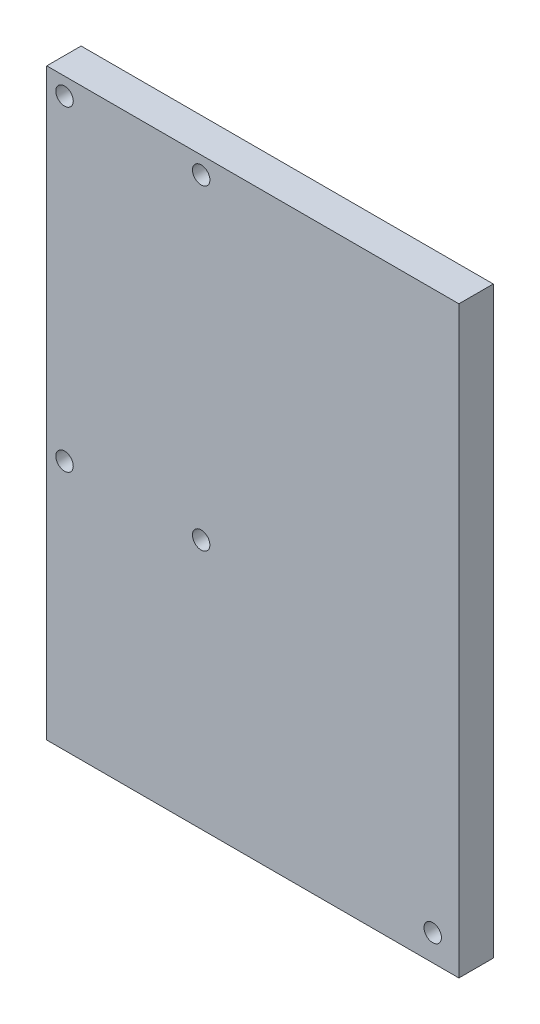
ISO-10303-21;
HEADER;
FILE_DESCRIPTION(('STEP AP214'),'2;1');
FILE_NAME('part.step','',(''),(''),'','','');
FILE_SCHEMA(('AUTOMOTIVE_DESIGN { 1 0 10303 214 1 1 1 1 }'));
ENDSEC;
DATA;
#1=APPLICATION_CONTEXT('core data for automotive mechanical design processes');
#2=APPLICATION_PROTOCOL_DEFINITION('international standard','automotive_design',2000,#1);
#3=PRODUCT_CONTEXT('',#1,'mechanical');
#4=PRODUCT('Part','Part','',(#3));
#5=PRODUCT_RELATED_PRODUCT_CATEGORY('part','',(#4));
#6=PRODUCT_DEFINITION_FORMATION('','',#4);
#7=PRODUCT_DEFINITION_CONTEXT('part definition',#1,'design');
#8=PRODUCT_DEFINITION('design','',#6,#7);
#9=PRODUCT_DEFINITION_SHAPE('','',#8);
#10=(LENGTH_UNIT() NAMED_UNIT(*) SI_UNIT(.MILLI.,.METRE.));
#11=(NAMED_UNIT(*) PLANE_ANGLE_UNIT() SI_UNIT($,.RADIAN.));
#12=(NAMED_UNIT(*) SI_UNIT($,.STERADIAN.) SOLID_ANGLE_UNIT());
#13=UNCERTAINTY_MEASURE_WITH_UNIT(LENGTH_MEASURE(1.E-05),#10,'distance_accuracy_value','');
#14=(GEOMETRIC_REPRESENTATION_CONTEXT(3) GLOBAL_UNCERTAINTY_ASSIGNED_CONTEXT((#13)) GLOBAL_UNIT_ASSIGNED_CONTEXT((#10,
#11,#12)) REPRESENTATION_CONTEXT('',''));
#15=CARTESIAN_POINT('',(0.,0.,0.));
#16=DIRECTION('',(0.,0.,1.));
#17=DIRECTION('',(1.,0.,0.));
#18=AXIS2_PLACEMENT_3D('',#15,#16,#17);
#19=CARTESIAN_POINT('',(-12.5348999999999,25.527,5.));
#20=DIRECTION('',(0.,1.,0.));
#21=DIRECTION('',(-1.,0.,0.));
#22=AXIS2_PLACEMENT_3D('',#19,#20,#21);
#23=PLANE('',#22);
#24=DIRECTION('',(1.,0.,0.));
#25=VECTOR('',#24,1.);
#26=CARTESIAN_POINT('',(-12.5348999999999,25.527,0.));
#27=LINE('',#26,#25);
#28=CARTESIAN_POINT('',(-12.5348999999999,25.527,0.));
#29=VERTEX_POINT('',#28);
#30=CARTESIAN_POINT('',(47.4651000000001,25.527,0.));
#31=VERTEX_POINT('',#30);
#32=EDGE_CURVE('E110',#29,#31,#27,.T.);
#33=ORIENTED_EDGE('',*,*,#32,.F.);
#34=DIRECTION('',(0.,0.,-1.));
#35=VECTOR('',#34,1.);
#36=CARTESIAN_POINT('',(-12.5348999999999,25.527,5.));
#37=LINE('',#36,#35);
#38=CARTESIAN_POINT('',(-12.5348999999999,25.527,5.));
#39=VERTEX_POINT('',#38);
#40=EDGE_CURVE('E11',#39,#29,#37,.T.);
#41=ORIENTED_EDGE('',*,*,#40,.F.);
#42=DIRECTION('',(1.,0.,0.));
#43=VECTOR('',#42,1.);
#44=CARTESIAN_POINT('',(-12.5348999999999,25.527,5.));
#45=LINE('',#44,#43);
#46=CARTESIAN_POINT('',(47.4651000000001,25.527,5.));
#47=VERTEX_POINT('',#46);
#48=EDGE_CURVE('E101',#39,#47,#45,.T.);
#49=ORIENTED_EDGE('',*,*,#48,.T.);
#50=DIRECTION('',(0.,0.,-1.));
#51=VECTOR('',#50,1.);
#52=CARTESIAN_POINT('',(47.4651000000001,25.527,5.));
#53=LINE('',#52,#51);
#54=EDGE_CURVE('E78',#47,#31,#53,.T.);
#55=ORIENTED_EDGE('',*,*,#54,.T.);
#56=EDGE_LOOP('',(#33,#41,#49,#55));
#57=FACE_BOUND('',#56,.T.);
#58=ADVANCED_FACE('F39',(#57),#23,.T.);
#59=CARTESIAN_POINT('',(-12.5348999999999,25.527,5.));
#60=DIRECTION('',(1.,0.,0.));
#61=DIRECTION('',(0.,1.,0.));
#62=AXIS2_PLACEMENT_3D('',#59,#60,#61);
#63=PLANE('',#62);
#64=DIRECTION('',(0.,-1.,0.));
#65=VECTOR('',#64,1.);
#66=CARTESIAN_POINT('',(-12.5348999999999,25.527,0.));
#67=LINE('',#66,#65);
#68=CARTESIAN_POINT('',(-12.5348999999999,-59.473,0.));
#69=VERTEX_POINT('',#68);
#70=EDGE_CURVE('E75',#29,#69,#67,.T.);
#71=ORIENTED_EDGE('',*,*,#70,.T.);
#72=DIRECTION('',(0.,0.,-1.));
#73=VECTOR('',#72,1.);
#74=CARTESIAN_POINT('',(-12.5348999999999,-59.473,5.));
#75=LINE('',#74,#73);
#76=CARTESIAN_POINT('',(-12.5348999999999,-59.473,5.));
#77=VERTEX_POINT('',#76);
#78=EDGE_CURVE('E48',#77,#69,#75,.T.);
#79=ORIENTED_EDGE('',*,*,#78,.F.);
#80=DIRECTION('',(0.,-1.,0.));
#81=VECTOR('',#80,1.);
#82=CARTESIAN_POINT('',(-12.5348999999999,25.527,5.));
#83=LINE('',#82,#81);
#84=EDGE_CURVE('E89',#39,#77,#83,.T.);
#85=ORIENTED_EDGE('',*,*,#84,.F.);
#86=ORIENTED_EDGE('',*,*,#40,.T.);
#87=EDGE_LOOP('',(#71,#79,#85,#86));
#88=FACE_BOUND('',#87,.T.);
#89=ADVANCED_FACE('F146',(#88),#63,.F.);
#90=CARTESIAN_POINT('',(-12.5348999999999,-59.473,5.));
#91=DIRECTION('',(0.,1.,0.));
#92=DIRECTION('',(0.,0.,1.));
#93=AXIS2_PLACEMENT_3D('',#90,#91,#92);
#94=PLANE('',#93);
#95=DIRECTION('',(1.,0.,0.));
#96=VECTOR('',#95,1.);
#97=CARTESIAN_POINT('',(-12.5348999999999,-59.473,0.));
#98=LINE('',#97,#96);
#99=CARTESIAN_POINT('',(47.4651000000001,-59.473,0.));
#100=VERTEX_POINT('',#99);
#101=EDGE_CURVE('E100',#69,#100,#98,.T.);
#102=ORIENTED_EDGE('',*,*,#101,.T.);
#103=DIRECTION('',(0.,0.,-1.));
#104=VECTOR('',#103,1.);
#105=CARTESIAN_POINT('',(47.4651000000001,-59.473,5.));
#106=LINE('',#105,#104);
#107=CARTESIAN_POINT('',(47.4651000000001,-59.473,5.));
#108=VERTEX_POINT('',#107);
#109=EDGE_CURVE('E94',#108,#100,#106,.T.);
#110=ORIENTED_EDGE('',*,*,#109,.F.);
#111=DIRECTION('',(1.,0.,0.));
#112=VECTOR('',#111,1.);
#113=CARTESIAN_POINT('',(-12.5348999999999,-59.473,5.));
#114=LINE('',#113,#112);
#115=EDGE_CURVE('E83',#77,#108,#114,.T.);
#116=ORIENTED_EDGE('',*,*,#115,.F.);
#117=ORIENTED_EDGE('',*,*,#78,.T.);
#118=EDGE_LOOP('',(#102,#110,#116,#117));
#119=FACE_BOUND('',#118,.T.);
#120=ADVANCED_FACE('F92',(#119),#94,.F.);
#121=CARTESIAN_POINT('',(47.4651000000001,25.527,5.));
#122=DIRECTION('',(1.,0.,0.));
#123=DIRECTION('',(0.,1.,0.));
#124=AXIS2_PLACEMENT_3D('',#121,#122,#123);
#125=PLANE('',#124);
#126=DIRECTION('',(0.,-1.,0.));
#127=VECTOR('',#126,1.);
#128=CARTESIAN_POINT('',(47.4651000000001,25.527,0.));
#129=LINE('',#128,#127);
#130=EDGE_CURVE('E109',#31,#100,#129,.T.);
#131=ORIENTED_EDGE('',*,*,#130,.F.);
#132=ORIENTED_EDGE('',*,*,#54,.F.);
#133=DIRECTION('',(0.,-1.,0.));
#134=VECTOR('',#133,1.);
#135=CARTESIAN_POINT('',(47.4651000000001,25.527,5.));
#136=LINE('',#135,#134);
#137=EDGE_CURVE('E90',#47,#108,#136,.T.);
#138=ORIENTED_EDGE('',*,*,#137,.T.);
#139=ORIENTED_EDGE('',*,*,#109,.T.);
#140=EDGE_LOOP('',(#131,#132,#138,#139));
#141=FACE_BOUND('',#140,.T.);
#142=ADVANCED_FACE('F99',(#141),#125,.T.);
#143=CARTESIAN_POINT('',(0.,0.,5.));
#144=DIRECTION('',(0.,0.,-1.));
#145=DIRECTION('',(-1.,0.,0.));
#146=AXIS2_PLACEMENT_3D('',#143,#144,#145);
#147=PLANE('',#146);
#148=CARTESIAN_POINT('',(43.6551,-55.6630000000007,5.));
#149=DIRECTION('',(0.,0.,1.));
#150=DIRECTION('',(1.,0.,0.));
#151=AXIS2_PLACEMENT_3D('',#148,#149,#150);
#152=CIRCLE('',#151,1.27);
#153=CARTESIAN_POINT('',(44.9251,-55.6630000000007,5.));
#154=VERTEX_POINT('',#153);
#155=EDGE_CURVE('E200',#154,#154,#152,.T.);
#156=ORIENTED_EDGE('',*,*,#155,.F.);
#157=EDGE_LOOP('',(#156));
#158=FACE_BOUND('',#157,.T.);
#159=CARTESIAN_POINT('',(9.94410000000011,23.0124,5.));
#160=DIRECTION('',(0.,0.,1.));
#161=DIRECTION('',(1.,0.,0.));
#162=AXIS2_PLACEMENT_3D('',#159,#160,#161);
#163=CIRCLE('',#162,1.27);
#164=CARTESIAN_POINT('',(11.2141000000001,23.0124,5.));
#165=VERTEX_POINT('',#164);
#166=EDGE_CURVE('E191',#165,#165,#163,.T.);
#167=ORIENTED_EDGE('',*,*,#166,.F.);
#168=EDGE_LOOP('',(#167));
#169=FACE_BOUND('',#168,.T.);
#170=CARTESIAN_POINT('',(-9.9440999999999,23.0124,5.));
#171=DIRECTION('',(0.,0.,1.));
#172=DIRECTION('',(1.,0.,0.));
#173=AXIS2_PLACEMENT_3D('',#170,#171,#172);
#174=CIRCLE('',#173,1.27);
#175=CARTESIAN_POINT('',(-8.67409999999989,23.0124,5.));
#176=VERTEX_POINT('',#175);
#177=EDGE_CURVE('E188',#176,#176,#174,.T.);
#178=ORIENTED_EDGE('',*,*,#177,.F.);
#179=EDGE_LOOP('',(#178));
#180=FACE_BOUND('',#179,.T.);
#181=CARTESIAN_POINT('',(-9.9440999999999,-23.0124,5.));
#182=DIRECTION('',(0.,0.,1.));
#183=DIRECTION('',(1.,0.,0.));
#184=AXIS2_PLACEMENT_3D('',#181,#182,#183);
#185=CIRCLE('',#184,1.27);
#186=CARTESIAN_POINT('',(-8.67409999999989,-23.0124,5.));
#187=VERTEX_POINT('',#186);
#188=EDGE_CURVE('E190',#187,#187,#185,.T.);
#189=ORIENTED_EDGE('',*,*,#188,.F.);
#190=EDGE_LOOP('',(#189));
#191=FACE_BOUND('',#190,.T.);
#192=CARTESIAN_POINT('',(9.94410000000011,-23.0124,5.));
#193=DIRECTION('',(0.,0.,1.));
#194=DIRECTION('',(1.,0.,0.));
#195=AXIS2_PLACEMENT_3D('',#192,#193,#194);
#196=CIRCLE('',#195,1.27);
#197=CARTESIAN_POINT('',(11.2141000000001,-23.0124,5.));
#198=VERTEX_POINT('',#197);
#199=EDGE_CURVE('E118',#198,#198,#196,.T.);
#200=ORIENTED_EDGE('',*,*,#199,.F.);
#201=EDGE_LOOP('',(#200));
#202=FACE_BOUND('',#201,.T.);
#203=ORIENTED_EDGE('',*,*,#48,.F.);
#204=ORIENTED_EDGE('',*,*,#84,.T.);
#205=ORIENTED_EDGE('',*,*,#115,.T.);
#206=ORIENTED_EDGE('',*,*,#137,.F.);
#207=EDGE_LOOP('',(#203,#204,#205,#206));
#208=FACE_BOUND('',#207,.T.);
#209=ADVANCED_FACE('F86',(#158,#169,#180,#191,#202,#208),#147,.F.);
#210=CARTESIAN_POINT('',(0.,0.,0.));
#211=DIRECTION('',(0.,0.,-1.));
#212=DIRECTION('',(-1.,0.,0.));
#213=AXIS2_PLACEMENT_3D('',#210,#211,#212);
#214=PLANE('',#213);
#215=CARTESIAN_POINT('',(43.6551,-55.6630000000007,0.));
#216=DIRECTION('',(0.,0.,-1.));
#217=DIRECTION('',(-1.,0.,0.));
#218=AXIS2_PLACEMENT_3D('',#215,#216,#217);
#219=CIRCLE('',#218,1.27);
#220=CARTESIAN_POINT('',(42.3851,-55.6630000000007,0.));
#221=VERTEX_POINT('',#220);
#222=EDGE_CURVE('E45',#221,#221,#219,.T.);
#223=ORIENTED_EDGE('',*,*,#222,.F.);
#224=EDGE_LOOP('',(#223));
#225=FACE_BOUND('',#224,.T.);
#226=CARTESIAN_POINT('',(9.94410000000011,23.0124,0.));
#227=DIRECTION('',(0.,0.,-1.));
#228=DIRECTION('',(-1.,0.,0.));
#229=AXIS2_PLACEMENT_3D('',#226,#227,#228);
#230=CIRCLE('',#229,1.27);
#231=CARTESIAN_POINT('',(8.67410000000011,23.0124,0.));
#232=VERTEX_POINT('',#231);
#233=EDGE_CURVE('E123',#232,#232,#230,.T.);
#234=ORIENTED_EDGE('',*,*,#233,.F.);
#235=EDGE_LOOP('',(#234));
#236=FACE_BOUND('',#235,.T.);
#237=CARTESIAN_POINT('',(-9.9440999999999,23.0124,0.));
#238=DIRECTION('',(0.,0.,-1.));
#239=DIRECTION('',(-1.,0.,0.));
#240=AXIS2_PLACEMENT_3D('',#237,#238,#239);
#241=CIRCLE('',#240,1.27);
#242=CARTESIAN_POINT('',(-11.2140999999999,23.0124,0.));
#243=VERTEX_POINT('',#242);
#244=EDGE_CURVE('E124',#243,#243,#241,.T.);
#245=ORIENTED_EDGE('',*,*,#244,.F.);
#246=EDGE_LOOP('',(#245));
#247=FACE_BOUND('',#246,.T.);
#248=CARTESIAN_POINT('',(-9.9440999999999,-23.0124,0.));
#249=DIRECTION('',(0.,0.,-1.));
#250=DIRECTION('',(-1.,0.,0.));
#251=AXIS2_PLACEMENT_3D('',#248,#249,#250);
#252=CIRCLE('',#251,1.27);
#253=CARTESIAN_POINT('',(-11.2140999999999,-23.0124,0.));
#254=VERTEX_POINT('',#253);
#255=EDGE_CURVE('E116',#254,#254,#252,.T.);
#256=ORIENTED_EDGE('',*,*,#255,.F.);
#257=EDGE_LOOP('',(#256));
#258=FACE_BOUND('',#257,.T.);
#259=CARTESIAN_POINT('',(9.94410000000011,-23.0124,0.));
#260=DIRECTION('',(0.,0.,-1.));
#261=DIRECTION('',(-1.,0.,0.));
#262=AXIS2_PLACEMENT_3D('',#259,#260,#261);
#263=CIRCLE('',#262,1.27);
#264=CARTESIAN_POINT('',(8.67410000000011,-23.0124,0.));
#265=VERTEX_POINT('',#264);
#266=EDGE_CURVE('E117',#265,#265,#263,.T.);
#267=ORIENTED_EDGE('',*,*,#266,.F.);
#268=EDGE_LOOP('',(#267));
#269=FACE_BOUND('',#268,.T.);
#270=ORIENTED_EDGE('',*,*,#32,.T.);
#271=ORIENTED_EDGE('',*,*,#130,.T.);
#272=ORIENTED_EDGE('',*,*,#101,.F.);
#273=ORIENTED_EDGE('',*,*,#70,.F.);
#274=EDGE_LOOP('',(#270,#271,#272,#273));
#275=FACE_BOUND('',#274,.T.);
#276=ADVANCED_FACE('F133',(#225,#236,#247,#258,#269,#275),#214,.T.);
#277=CARTESIAN_POINT('',(9.94410000000011,-23.0124,-22.));
#278=DIRECTION('',(0.,0.,1.));
#279=DIRECTION('',(1.,0.,0.));
#280=AXIS2_PLACEMENT_3D('',#277,#278,#279);
#281=CYLINDRICAL_SURFACE('',#280,1.27);
#282=ORIENTED_EDGE('',*,*,#266,.T.);
#283=EDGE_LOOP('',(#282));
#284=FACE_BOUND('',#283,.T.);
#285=ORIENTED_EDGE('',*,*,#199,.T.);
#286=EDGE_LOOP('',(#285));
#287=FACE_BOUND('',#286,.T.);
#288=ADVANCED_FACE('F139',(#284,#287),#281,.F.);
#289=CARTESIAN_POINT('',(-9.9440999999999,-23.0124,-22.));
#290=DIRECTION('',(0.,0.,1.));
#291=DIRECTION('',(1.,0.,0.));
#292=AXIS2_PLACEMENT_3D('',#289,#290,#291);
#293=CYLINDRICAL_SURFACE('',#292,1.27);
#294=ORIENTED_EDGE('',*,*,#255,.T.);
#295=EDGE_LOOP('',(#294));
#296=FACE_BOUND('',#295,.T.);
#297=ORIENTED_EDGE('',*,*,#188,.T.);
#298=EDGE_LOOP('',(#297));
#299=FACE_BOUND('',#298,.T.);
#300=ADVANCED_FACE('F168',(#296,#299),#293,.F.);
#301=CARTESIAN_POINT('',(-9.9440999999999,23.0124,-22.));
#302=DIRECTION('',(0.,0.,1.));
#303=DIRECTION('',(1.,0.,0.));
#304=AXIS2_PLACEMENT_3D('',#301,#302,#303);
#305=CYLINDRICAL_SURFACE('',#304,1.27);
#306=ORIENTED_EDGE('',*,*,#244,.T.);
#307=EDGE_LOOP('',(#306));
#308=FACE_BOUND('',#307,.T.);
#309=ORIENTED_EDGE('',*,*,#177,.T.);
#310=EDGE_LOOP('',(#309));
#311=FACE_BOUND('',#310,.T.);
#312=ADVANCED_FACE('F180',(#308,#311),#305,.F.);
#313=CARTESIAN_POINT('',(9.94410000000011,23.0124,-22.));
#314=DIRECTION('',(0.,0.,1.));
#315=DIRECTION('',(1.,0.,0.));
#316=AXIS2_PLACEMENT_3D('',#313,#314,#315);
#317=CYLINDRICAL_SURFACE('',#316,1.27);
#318=ORIENTED_EDGE('',*,*,#233,.T.);
#319=EDGE_LOOP('',(#318));
#320=FACE_BOUND('',#319,.T.);
#321=ORIENTED_EDGE('',*,*,#166,.T.);
#322=EDGE_LOOP('',(#321));
#323=FACE_BOUND('',#322,.T.);
#324=ADVANCED_FACE('F171',(#320,#323),#317,.F.);
#325=CARTESIAN_POINT('',(43.6551,-55.6630000000007,-22.));
#326=DIRECTION('',(0.,0.,1.));
#327=DIRECTION('',(1.,0.,0.));
#328=AXIS2_PLACEMENT_3D('',#325,#326,#327);
#329=CYLINDRICAL_SURFACE('',#328,1.27);
#330=ORIENTED_EDGE('',*,*,#222,.T.);
#331=EDGE_LOOP('',(#330));
#332=FACE_BOUND('',#331,.T.);
#333=ORIENTED_EDGE('',*,*,#155,.T.);
#334=EDGE_LOOP('',(#333));
#335=FACE_BOUND('',#334,.T.);
#336=ADVANCED_FACE('F134',(#332,#335),#329,.F.);
#337=CLOSED_SHELL('',(#58,#89,#120,#142,#209,#276,#288,#300,#312,#324,#336));
#338=MANIFOLD_SOLID_BREP('B2',#337);
#339=ADVANCED_BREP_SHAPE_REPRESENTATION('',(#18,#338),#14);
#340=SHAPE_DEFINITION_REPRESENTATION(#9,#339);
ENDSEC;
END-ISO-10303-21;
